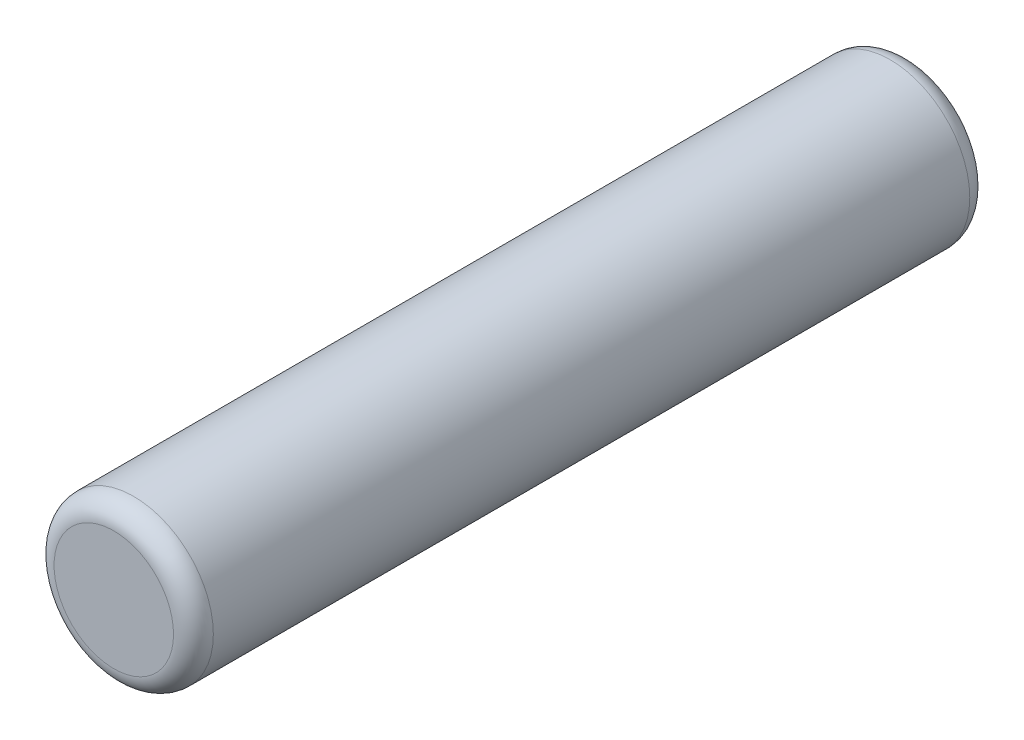
ISO-10303-21;
HEADER;
FILE_DESCRIPTION(('STEP AP214'),'2;1');
FILE_NAME('part.step','',(''),(''),'','','');
FILE_SCHEMA(('AUTOMOTIVE_DESIGN { 1 0 10303 214 1 1 1 1 }'));
ENDSEC;
DATA;
#1=APPLICATION_CONTEXT('core data for automotive mechanical design processes');
#2=APPLICATION_PROTOCOL_DEFINITION('international standard','automotive_design',2000,#1);
#3=PRODUCT_CONTEXT('',#1,'mechanical');
#4=PRODUCT('Part','Part','',(#3));
#5=PRODUCT_RELATED_PRODUCT_CATEGORY('part','',(#4));
#6=PRODUCT_DEFINITION_FORMATION('','',#4);
#7=PRODUCT_DEFINITION_CONTEXT('part definition',#1,'design');
#8=PRODUCT_DEFINITION('design','',#6,#7);
#9=PRODUCT_DEFINITION_SHAPE('','',#8);
#10=(LENGTH_UNIT() NAMED_UNIT(*) SI_UNIT(.MILLI.,.METRE.));
#11=(NAMED_UNIT(*) PLANE_ANGLE_UNIT() SI_UNIT($,.RADIAN.));
#12=(NAMED_UNIT(*) SI_UNIT($,.STERADIAN.) SOLID_ANGLE_UNIT());
#13=UNCERTAINTY_MEASURE_WITH_UNIT(LENGTH_MEASURE(1.E-05),#10,'distance_accuracy_value','');
#14=(GEOMETRIC_REPRESENTATION_CONTEXT(3) GLOBAL_UNCERTAINTY_ASSIGNED_CONTEXT((#13)) GLOBAL_UNIT_ASSIGNED_CONTEXT((#10,
#11,#12)) REPRESENTATION_CONTEXT('',''));
#15=CARTESIAN_POINT('',(0.,0.,0.));
#16=DIRECTION('',(0.,0.,1.));
#17=DIRECTION('',(1.,0.,0.));
#18=AXIS2_PLACEMENT_3D('',#15,#16,#17);
#19=CARTESIAN_POINT('',(0.,0.,10.));
#20=DIRECTION('',(0.,0.,-1.));
#21=DIRECTION('',(-1.,0.,0.));
#22=AXIS2_PLACEMENT_3D('',#19,#20,#21);
#23=CYLINDRICAL_SURFACE('',#22,1.);
#24=CARTESIAN_POINT('',(0.,0.,0.25));
#25=DIRECTION('',(0.,0.,1.));
#26=DIRECTION('',(1.,0.,0.));
#27=AXIS2_PLACEMENT_3D('',#24,#25,#26);
#28=CIRCLE('',#27,1.);
#29=CARTESIAN_POINT('',(1.,0.,0.25));
#30=VERTEX_POINT('',#29);
#31=EDGE_CURVE('E48',#30,#30,#28,.T.);
#32=ORIENTED_EDGE('',*,*,#31,.T.);
#33=EDGE_LOOP('',(#32));
#34=FACE_BOUND('',#33,.T.);
#35=CARTESIAN_POINT('',(0.,0.,9.75));
#36=DIRECTION('',(0.,0.,1.));
#37=DIRECTION('',(1.,0.,0.));
#38=AXIS2_PLACEMENT_3D('',#35,#36,#37);
#39=CIRCLE('',#38,1.);
#40=CARTESIAN_POINT('',(1.,0.,9.75));
#41=VERTEX_POINT('',#40);
#42=EDGE_CURVE('E52',#41,#41,#39,.F.);
#43=ORIENTED_EDGE('',*,*,#42,.T.);
#44=EDGE_LOOP('',(#43));
#45=FACE_BOUND('',#44,.T.);
#46=ADVANCED_FACE('F37',(#34,#45),#23,.T.);
#47=CARTESIAN_POINT('',(0.,0.,10.));
#48=DIRECTION('',(0.,0.,1.));
#49=DIRECTION('',(1.,0.,0.));
#50=AXIS2_PLACEMENT_3D('',#47,#48,#49);
#51=PLANE('',#50);
#52=CARTESIAN_POINT('',(0.,0.,10.));
#53=DIRECTION('',(0.,0.,1.));
#54=DIRECTION('',(1.,0.,0.));
#55=AXIS2_PLACEMENT_3D('',#52,#53,#54);
#56=CIRCLE('',#55,0.75);
#57=CARTESIAN_POINT('',(0.75,0.,10.));
#58=VERTEX_POINT('',#57);
#59=EDGE_CURVE('E10',#58,#58,#56,.T.);
#60=ORIENTED_EDGE('',*,*,#59,.T.);
#61=EDGE_LOOP('',(#60));
#62=FACE_BOUND('',#61,.T.);
#63=ADVANCED_FACE('F68',(#62),#51,.T.);
#64=CARTESIAN_POINT('',(0.,0.,0.));
#65=DIRECTION('',(0.,0.,1.));
#66=DIRECTION('',(1.,0.,0.));
#67=AXIS2_PLACEMENT_3D('',#64,#65,#66);
#68=PLANE('',#67);
#69=CARTESIAN_POINT('',(0.,0.,0.));
#70=DIRECTION('',(0.,0.,1.));
#71=DIRECTION('',(1.,0.,0.));
#72=AXIS2_PLACEMENT_3D('',#69,#70,#71);
#73=CIRCLE('',#72,0.75);
#74=CARTESIAN_POINT('',(0.75,0.,0.));
#75=VERTEX_POINT('',#74);
#76=EDGE_CURVE('E44',#75,#75,#73,.F.);
#77=ORIENTED_EDGE('',*,*,#76,.T.);
#78=EDGE_LOOP('',(#77));
#79=FACE_BOUND('',#78,.T.);
#80=ADVANCED_FACE('F65',(#79),#68,.F.);
#81=CARTESIAN_POINT('',(0.,0.,0.25));
#82=DIRECTION('',(0.,0.,1.));
#83=DIRECTION('',(1.,0.,0.));
#84=AXIS2_PLACEMENT_3D('',#81,#82,#83);
#85=TOROIDAL_SURFACE('',#84,0.75,0.25);
#86=ORIENTED_EDGE('',*,*,#76,.F.);
#87=EDGE_LOOP('',(#86));
#88=FACE_BOUND('',#87,.T.);
#89=ORIENTED_EDGE('',*,*,#31,.F.);
#90=EDGE_LOOP('',(#89));
#91=FACE_BOUND('',#90,.T.);
#92=ADVANCED_FACE('F61',(#88,#91),#85,.T.);
#93=CARTESIAN_POINT('',(0.,0.,9.75));
#94=DIRECTION('',(0.,0.,1.));
#95=DIRECTION('',(1.,0.,0.));
#96=AXIS2_PLACEMENT_3D('',#93,#94,#95);
#97=TOROIDAL_SURFACE('',#96,0.75,0.25);
#98=ORIENTED_EDGE('',*,*,#42,.F.);
#99=EDGE_LOOP('',(#98));
#100=FACE_BOUND('',#99,.T.);
#101=ORIENTED_EDGE('',*,*,#59,.F.);
#102=EDGE_LOOP('',(#101));
#103=FACE_BOUND('',#102,.T.);
#104=ADVANCED_FACE('F39',(#100,#103),#97,.T.);
#105=CLOSED_SHELL('',(#46,#63,#80,#92,#104));
#106=MANIFOLD_SOLID_BREP('B2',#105);
#107=ADVANCED_BREP_SHAPE_REPRESENTATION('',(#18,#106),#14);
#108=SHAPE_DEFINITION_REPRESENTATION(#9,#107);
ENDSEC;
END-ISO-10303-21;
